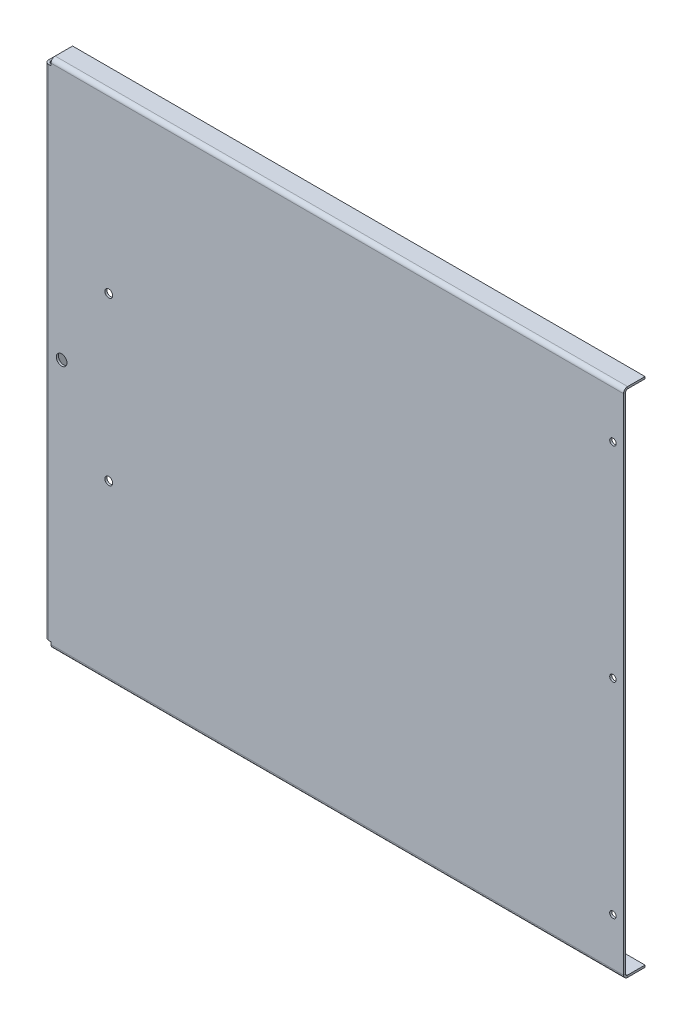
ISO-10303-21;
HEADER;
FILE_DESCRIPTION(('STEP AP214'),'2;1');
FILE_NAME('part.step','',(''),(''),'','','');
FILE_SCHEMA(('AUTOMOTIVE_DESIGN { 1 0 10303 214 1 1 1 1 }'));
ENDSEC;
DATA;
#1=APPLICATION_CONTEXT('core data for automotive mechanical design processes');
#2=APPLICATION_PROTOCOL_DEFINITION('international standard','automotive_design',2000,#1);
#3=PRODUCT_CONTEXT('',#1,'mechanical');
#4=PRODUCT('Part','Part','',(#3));
#5=PRODUCT_RELATED_PRODUCT_CATEGORY('part','',(#4));
#6=PRODUCT_DEFINITION_FORMATION('','',#4);
#7=PRODUCT_DEFINITION_CONTEXT('part definition',#1,'design');
#8=PRODUCT_DEFINITION('design','',#6,#7);
#9=PRODUCT_DEFINITION_SHAPE('','',#8);
#10=(LENGTH_UNIT() NAMED_UNIT(*) SI_UNIT(.MILLI.,.METRE.));
#11=(NAMED_UNIT(*) PLANE_ANGLE_UNIT() SI_UNIT($,.RADIAN.));
#12=(NAMED_UNIT(*) SI_UNIT($,.STERADIAN.) SOLID_ANGLE_UNIT());
#13=UNCERTAINTY_MEASURE_WITH_UNIT(LENGTH_MEASURE(1.E-05),#10,'distance_accuracy_value','');
#14=(GEOMETRIC_REPRESENTATION_CONTEXT(3) GLOBAL_UNCERTAINTY_ASSIGNED_CONTEXT((#13)) GLOBAL_UNIT_ASSIGNED_CONTEXT((#10,
#11,#12)) REPRESENTATION_CONTEXT('',''));
#15=CARTESIAN_POINT('',(0.,0.,0.));
#16=DIRECTION('',(0.,0.,1.));
#17=DIRECTION('',(1.,0.,0.));
#18=AXIS2_PLACEMENT_3D('',#15,#16,#17);
#19=CARTESIAN_POINT('',(0.,0.,-1.524));
#20=DIRECTION('',(0.,0.,-1.));
#21=DIRECTION('',(-1.,0.,0.));
#22=AXIS2_PLACEMENT_3D('',#19,#20,#21);
#23=PLANE('',#22);
#24=CARTESIAN_POINT('',(-202.819,0.,-1.524));
#25=DIRECTION('',(0.,0.,-1.));
#26=DIRECTION('',(-1.,0.,0.));
#27=AXIS2_PLACEMENT_3D('',#24,#25,#26);
#28=CIRCLE('',#27,3.9624);
#29=CARTESIAN_POINT('',(-206.7814,0.,-1.524));
#30=VERTEX_POINT('',#29);
#31=EDGE_CURVE('E571',#30,#30,#28,.F.);
#32=ORIENTED_EDGE('',*,*,#31,.T.);
#33=EDGE_LOOP('',(#32));
#34=FACE_BOUND('',#33,.T.);
#35=CARTESIAN_POINT('',(-167.767,60.452,-1.524));
#36=DIRECTION('',(0.,0.,-1.));
#37=DIRECTION('',(-1.,0.,0.));
#38=AXIS2_PLACEMENT_3D('',#35,#36,#37);
#39=CIRCLE('',#38,2.8956);
#40=CARTESIAN_POINT('',(-170.6626,60.452,-1.524));
#41=VERTEX_POINT('',#40);
#42=EDGE_CURVE('E567',#41,#41,#39,.F.);
#43=ORIENTED_EDGE('',*,*,#42,.T.);
#44=EDGE_LOOP('',(#43));
#45=FACE_BOUND('',#44,.T.);
#46=CARTESIAN_POINT('',(-167.767,-60.452,-1.524));
#47=DIRECTION('',(0.,0.,-1.));
#48=DIRECTION('',(-1.,0.,0.));
#49=AXIS2_PLACEMENT_3D('',#46,#47,#48);
#50=CIRCLE('',#49,2.8956);
#51=CARTESIAN_POINT('',(-170.6626,-60.452,-1.524));
#52=VERTEX_POINT('',#51);
#53=EDGE_CURVE('E559',#52,#52,#50,.F.);
#54=ORIENTED_EDGE('',*,*,#53,.T.);
#55=EDGE_LOOP('',(#54));
#56=FACE_BOUND('',#55,.T.);
#57=CARTESIAN_POINT('',(207.645,152.4,-1.524));
#58=DIRECTION('',(0.,0.,-1.));
#59=DIRECTION('',(-1.,0.,0.));
#60=AXIS2_PLACEMENT_3D('',#57,#58,#59);
#61=CIRCLE('',#60,2.413);
#62=CARTESIAN_POINT('',(205.232,152.4,-1.524));
#63=VERTEX_POINT('',#62);
#64=EDGE_CURVE('E551',#63,#63,#61,.F.);
#65=ORIENTED_EDGE('',*,*,#64,.T.);
#66=EDGE_LOOP('',(#65));
#67=FACE_BOUND('',#66,.T.);
#68=CARTESIAN_POINT('',(207.645,0.,-1.524));
#69=DIRECTION('',(0.,0.,-1.));
#70=DIRECTION('',(-1.,0.,0.));
#71=AXIS2_PLACEMENT_3D('',#68,#69,#70);
#72=CIRCLE('',#71,2.413);
#73=CARTESIAN_POINT('',(205.232,0.,-1.524));
#74=VERTEX_POINT('',#73);
#75=EDGE_CURVE('E543',#74,#74,#72,.F.);
#76=ORIENTED_EDGE('',*,*,#75,.T.);
#77=EDGE_LOOP('',(#76));
#78=FACE_BOUND('',#77,.T.);
#79=CARTESIAN_POINT('',(207.645,-152.4,-1.524));
#80=DIRECTION('',(0.,0.,-1.));
#81=DIRECTION('',(-1.,0.,0.));
#82=AXIS2_PLACEMENT_3D('',#79,#80,#81);
#83=CIRCLE('',#82,2.413);
#84=CARTESIAN_POINT('',(205.232,-152.4,-1.524));
#85=VERTEX_POINT('',#84);
#86=EDGE_CURVE('E535',#85,#85,#83,.F.);
#87=ORIENTED_EDGE('',*,*,#86,.T.);
#88=EDGE_LOOP('',(#87));
#89=FACE_BOUND('',#88,.T.);
#90=DIRECTION('',(-1.,0.,0.));
#91=VECTOR('',#90,1.);
#92=CARTESIAN_POINT('',(-215.519,-185.674,-1.524));
#93=LINE('',#92,#91);
#94=CARTESIAN_POINT('',(-210.693,-185.674,-1.524));
#95=VERTEX_POINT('',#94);
#96=CARTESIAN_POINT('',(-212.471,-185.674,-1.524));
#97=VERTEX_POINT('',#96);
#98=EDGE_CURVE('E502',#95,#97,#93,.T.);
#99=ORIENTED_EDGE('',*,*,#98,.T.);
#100=DIRECTION('',(0.,1.,0.));
#101=VECTOR('',#100,1.);
#102=CARTESIAN_POINT('',(-212.471,185.674,-1.524));
#103=LINE('',#102,#101);
#104=CARTESIAN_POINT('',(-212.471,185.674,-1.524));
#105=VERTEX_POINT('',#104);
#106=EDGE_CURVE('E315',#105,#97,#103,.F.);
#107=ORIENTED_EDGE('',*,*,#106,.F.);
#108=DIRECTION('',(1.,0.,0.));
#109=VECTOR('',#108,1.);
#110=CARTESIAN_POINT('',(-215.519,185.674,-1.524));
#111=LINE('',#110,#109);
#112=CARTESIAN_POINT('',(-210.693,185.674,-1.524));
#113=VERTEX_POINT('',#112);
#114=EDGE_CURVE('E490',#105,#113,#111,.T.);
#115=ORIENTED_EDGE('',*,*,#114,.T.);
#116=DIRECTION('',(0.,1.,0.));
#117=VECTOR('',#116,1.);
#118=CARTESIAN_POINT('',(-210.693,190.5,-1.524));
#119=LINE('',#118,#117);
#120=CARTESIAN_POINT('',(-210.693,187.452,-1.524));
#121=VERTEX_POINT('',#120);
#122=EDGE_CURVE('E475',#113,#121,#119,.T.);
#123=ORIENTED_EDGE('',*,*,#122,.T.);
#124=DIRECTION('',(1.,0.,0.));
#125=VECTOR('',#124,1.);
#126=CARTESIAN_POINT('',(215.519,187.452,-1.524));
#127=LINE('',#126,#125);
#128=CARTESIAN_POINT('',(215.519,187.452,-1.524));
#129=VERTEX_POINT('',#128);
#130=EDGE_CURVE('E461',#129,#121,#127,.F.);
#131=ORIENTED_EDGE('',*,*,#130,.F.);
#132=DIRECTION('',(0.,1.,0.));
#133=VECTOR('',#132,1.);
#134=CARTESIAN_POINT('',(215.519,-190.5,-1.524));
#135=LINE('',#134,#133);
#136=CARTESIAN_POINT('',(215.519,-187.452,-1.524));
#137=VERTEX_POINT('',#136);
#138=EDGE_CURVE('E13',#137,#129,#135,.T.);
#139=ORIENTED_EDGE('',*,*,#138,.F.);
#140=DIRECTION('',(-1.,0.,0.));
#141=VECTOR('',#140,1.);
#142=CARTESIAN_POINT('',(-210.693,-187.452,-1.524));
#143=LINE('',#142,#141);
#144=CARTESIAN_POINT('',(-210.693,-187.452,-1.524));
#145=VERTEX_POINT('',#144);
#146=EDGE_CURVE('E387',#145,#137,#143,.F.);
#147=ORIENTED_EDGE('',*,*,#146,.F.);
#148=DIRECTION('',(0.,1.,0.));
#149=VECTOR('',#148,1.);
#150=CARTESIAN_POINT('',(-210.693,-190.5,-1.524));
#151=LINE('',#150,#149);
#152=EDGE_CURVE('E480',#145,#95,#151,.T.);
#153=ORIENTED_EDGE('',*,*,#152,.T.);
#154=EDGE_LOOP('',(#99,#107,#115,#123,#131,#139,#147,#153));
#155=FACE_BOUND('',#154,.T.);
#156=ADVANCED_FACE('F107',(#34,#45,#56,#67,#78,#89,#155),#23,.T.);
#157=CARTESIAN_POINT('',(0.,0.,0.));
#158=DIRECTION('',(0.,0.,-1.));
#159=DIRECTION('',(-1.,0.,0.));
#160=AXIS2_PLACEMENT_3D('',#157,#158,#159);
#161=PLANE('',#160);
#162=CARTESIAN_POINT('',(-202.819,0.,0.));
#163=DIRECTION('',(0.,0.,1.));
#164=DIRECTION('',(1.,0.,0.));
#165=AXIS2_PLACEMENT_3D('',#162,#163,#164);
#166=CIRCLE('',#165,3.9624);
#167=CARTESIAN_POINT('',(-198.8566,0.,0.));
#168=VERTEX_POINT('',#167);
#169=EDGE_CURVE('E299',#168,#168,#166,.T.);
#170=ORIENTED_EDGE('',*,*,#169,.F.);
#171=EDGE_LOOP('',(#170));
#172=FACE_BOUND('',#171,.T.);
#173=CARTESIAN_POINT('',(-167.767,60.452,0.));
#174=DIRECTION('',(0.,0.,1.));
#175=DIRECTION('',(1.,0.,0.));
#176=AXIS2_PLACEMENT_3D('',#173,#174,#175);
#177=CIRCLE('',#176,2.8956);
#178=CARTESIAN_POINT('',(-164.8714,60.452,0.));
#179=VERTEX_POINT('',#178);
#180=EDGE_CURVE('E563',#179,#179,#177,.T.);
#181=ORIENTED_EDGE('',*,*,#180,.F.);
#182=EDGE_LOOP('',(#181));
#183=FACE_BOUND('',#182,.T.);
#184=CARTESIAN_POINT('',(-167.767,-60.452,0.));
#185=DIRECTION('',(0.,0.,1.));
#186=DIRECTION('',(1.,0.,0.));
#187=AXIS2_PLACEMENT_3D('',#184,#185,#186);
#188=CIRCLE('',#187,2.8956);
#189=CARTESIAN_POINT('',(-164.8714,-60.452,0.));
#190=VERTEX_POINT('',#189);
#191=EDGE_CURVE('E555',#190,#190,#188,.T.);
#192=ORIENTED_EDGE('',*,*,#191,.F.);
#193=EDGE_LOOP('',(#192));
#194=FACE_BOUND('',#193,.T.);
#195=CARTESIAN_POINT('',(207.645,152.4,0.));
#196=DIRECTION('',(0.,0.,1.));
#197=DIRECTION('',(1.,0.,0.));
#198=AXIS2_PLACEMENT_3D('',#195,#196,#197);
#199=CIRCLE('',#198,2.413);
#200=CARTESIAN_POINT('',(210.058,152.4,0.));
#201=VERTEX_POINT('',#200);
#202=EDGE_CURVE('E547',#201,#201,#199,.T.);
#203=ORIENTED_EDGE('',*,*,#202,.F.);
#204=EDGE_LOOP('',(#203));
#205=FACE_BOUND('',#204,.T.);
#206=CARTESIAN_POINT('',(207.645,0.,0.));
#207=DIRECTION('',(0.,0.,1.));
#208=DIRECTION('',(1.,0.,0.));
#209=AXIS2_PLACEMENT_3D('',#206,#207,#208);
#210=CIRCLE('',#209,2.413);
#211=CARTESIAN_POINT('',(210.058,0.,0.));
#212=VERTEX_POINT('',#211);
#213=EDGE_CURVE('E539',#212,#212,#210,.T.);
#214=ORIENTED_EDGE('',*,*,#213,.F.);
#215=EDGE_LOOP('',(#214));
#216=FACE_BOUND('',#215,.T.);
#217=CARTESIAN_POINT('',(207.645,-152.4,0.));
#218=DIRECTION('',(0.,0.,1.));
#219=DIRECTION('',(1.,0.,0.));
#220=AXIS2_PLACEMENT_3D('',#217,#218,#219);
#221=CIRCLE('',#220,2.413);
#222=CARTESIAN_POINT('',(210.058,-152.4,0.));
#223=VERTEX_POINT('',#222);
#224=EDGE_CURVE('E531',#223,#223,#221,.T.);
#225=ORIENTED_EDGE('',*,*,#224,.F.);
#226=EDGE_LOOP('',(#225));
#227=FACE_BOUND('',#226,.T.);
#228=DIRECTION('',(0.,1.,0.));
#229=VECTOR('',#228,1.);
#230=CARTESIAN_POINT('',(-212.471,185.674,0.));
#231=LINE('',#230,#229);
#232=CARTESIAN_POINT('',(-212.471,185.674,0.));
#233=VERTEX_POINT('',#232);
#234=CARTESIAN_POINT('',(-212.471,-185.674,0.));
#235=VERTEX_POINT('',#234);
#236=EDGE_CURVE('E131',#233,#235,#231,.F.);
#237=ORIENTED_EDGE('',*,*,#236,.T.);
#238=DIRECTION('',(-1.,0.,0.));
#239=VECTOR('',#238,1.);
#240=CARTESIAN_POINT('',(-215.519,-185.674,0.));
#241=LINE('',#240,#239);
#242=CARTESIAN_POINT('',(-210.693,-185.674,0.));
#243=VERTEX_POINT('',#242);
#244=EDGE_CURVE('E496',#243,#235,#241,.T.);
#245=ORIENTED_EDGE('',*,*,#244,.F.);
#246=DIRECTION('',(0.,1.,0.));
#247=VECTOR('',#246,1.);
#248=CARTESIAN_POINT('',(-210.693,-190.5,0.));
#249=LINE('',#248,#247);
#250=CARTESIAN_POINT('',(-210.693,-187.452,0.));
#251=VERTEX_POINT('',#250);
#252=EDGE_CURVE('E499',#251,#243,#249,.T.);
#253=ORIENTED_EDGE('',*,*,#252,.F.);
#254=DIRECTION('',(-1.,0.,0.));
#255=VECTOR('',#254,1.);
#256=CARTESIAN_POINT('',(-210.693,-187.452,0.));
#257=LINE('',#256,#255);
#258=CARTESIAN_POINT('',(215.519,-187.452,0.));
#259=VERTEX_POINT('',#258);
#260=EDGE_CURVE('E371',#251,#259,#257,.F.);
#261=ORIENTED_EDGE('',*,*,#260,.T.);
#262=DIRECTION('',(0.,1.,0.));
#263=VECTOR('',#262,1.);
#264=CARTESIAN_POINT('',(215.519,-190.5,0.));
#265=LINE('',#264,#263);
#266=CARTESIAN_POINT('',(215.519,187.452,0.));
#267=VERTEX_POINT('',#266);
#268=EDGE_CURVE('E111',#259,#267,#265,.T.);
#269=ORIENTED_EDGE('',*,*,#268,.T.);
#270=DIRECTION('',(1.,0.,0.));
#271=VECTOR('',#270,1.);
#272=CARTESIAN_POINT('',(215.519,187.452,0.));
#273=LINE('',#272,#271);
#274=CARTESIAN_POINT('',(-210.693,187.452,0.));
#275=VERTEX_POINT('',#274);
#276=EDGE_CURVE('E444',#267,#275,#273,.F.);
#277=ORIENTED_EDGE('',*,*,#276,.T.);
#278=DIRECTION('',(0.,1.,0.));
#279=VECTOR('',#278,1.);
#280=CARTESIAN_POINT('',(-210.693,190.5,0.));
#281=LINE('',#280,#279);
#282=CARTESIAN_POINT('',(-210.693,185.674,0.));
#283=VERTEX_POINT('',#282);
#284=EDGE_CURVE('E483',#283,#275,#281,.T.);
#285=ORIENTED_EDGE('',*,*,#284,.F.);
#286=DIRECTION('',(1.,0.,0.));
#287=VECTOR('',#286,1.);
#288=CARTESIAN_POINT('',(-215.519,185.674,0.));
#289=LINE('',#288,#287);
#290=EDGE_CURVE('E479',#233,#283,#289,.T.);
#291=ORIENTED_EDGE('',*,*,#290,.F.);
#292=EDGE_LOOP('',(#237,#245,#253,#261,#269,#277,#285,#291));
#293=FACE_BOUND('',#292,.T.);
#294=ADVANCED_FACE('F516',(#172,#183,#194,#205,#216,#227,#293),#161,.F.);
#295=CARTESIAN_POINT('',(-215.519,-185.674,-1.525));
#296=DIRECTION('',(0.,1.,0.));
#297=DIRECTION('',(0.,0.,1.));
#298=AXIS2_PLACEMENT_3D('',#295,#296,#297);
#299=PLANE('',#298);
#300=DIRECTION('',(0.,0.,1.));
#301=VECTOR('',#300,1.);
#302=CARTESIAN_POINT('',(-212.471,-185.674,-1.524));
#303=LINE('',#302,#301);
#304=EDGE_CURVE('E123',#97,#235,#303,.T.);
#305=ORIENTED_EDGE('',*,*,#304,.F.);
#306=ORIENTED_EDGE('',*,*,#98,.F.);
#307=DIRECTION('',(0.,0.,1.));
#308=VECTOR('',#307,1.);
#309=CARTESIAN_POINT('',(-210.693,-185.674,-1.525));
#310=LINE('',#309,#308);
#311=EDGE_CURVE('E472',#95,#243,#310,.T.);
#312=ORIENTED_EDGE('',*,*,#311,.T.);
#313=ORIENTED_EDGE('',*,*,#244,.T.);
#314=EDGE_LOOP('',(#305,#306,#312,#313));
#315=FACE_BOUND('',#314,.T.);
#316=ADVANCED_FACE('F513',(#315),#299,.F.);
#317=CARTESIAN_POINT('',(-215.519,185.674,-1.525));
#318=DIRECTION('',(0.,-1.,0.));
#319=DIRECTION('',(0.,0.,-1.));
#320=AXIS2_PLACEMENT_3D('',#317,#318,#319);
#321=PLANE('',#320);
#322=DIRECTION('',(0.,0.,1.));
#323=VECTOR('',#322,1.);
#324=CARTESIAN_POINT('',(-212.471,185.674,-1.524));
#325=LINE('',#324,#323);
#326=EDGE_CURVE('E307',#105,#233,#325,.T.);
#327=ORIENTED_EDGE('',*,*,#326,.T.);
#328=ORIENTED_EDGE('',*,*,#290,.T.);
#329=DIRECTION('',(0.,0.,1.));
#330=VECTOR('',#329,1.);
#331=CARTESIAN_POINT('',(-210.693,185.674,-1.525));
#332=LINE('',#331,#330);
#333=EDGE_CURVE('E486',#113,#283,#332,.T.);
#334=ORIENTED_EDGE('',*,*,#333,.F.);
#335=ORIENTED_EDGE('',*,*,#114,.F.);
#336=EDGE_LOOP('',(#327,#328,#334,#335));
#337=FACE_BOUND('',#336,.T.);
#338=ADVANCED_FACE('F618',(#337),#321,.F.);
#339=CARTESIAN_POINT('',(-210.693,-190.5,-1.525));
#340=DIRECTION('',(1.,0.,0.));
#341=DIRECTION('',(0.,1.,0.));
#342=AXIS2_PLACEMENT_3D('',#339,#340,#341);
#343=PLANE('',#342);
#344=DIRECTION('',(0.,0.,1.));
#345=VECTOR('',#344,1.);
#346=CARTESIAN_POINT('',(-210.693,-187.452,-1.524));
#347=LINE('',#346,#345);
#348=EDGE_CURVE('E379',#145,#251,#347,.T.);
#349=ORIENTED_EDGE('',*,*,#348,.T.);
#350=ORIENTED_EDGE('',*,*,#252,.T.);
#351=ORIENTED_EDGE('',*,*,#311,.F.);
#352=ORIENTED_EDGE('',*,*,#152,.F.);
#353=EDGE_LOOP('',(#349,#350,#351,#352));
#354=FACE_BOUND('',#353,.T.);
#355=ADVANCED_FACE('F514',(#354),#343,.F.);
#356=CARTESIAN_POINT('',(215.519,-190.5,-1.524));
#357=DIRECTION('',(1.,0.,0.));
#358=DIRECTION('',(0.,0.,-1.));
#359=AXIS2_PLACEMENT_3D('',#356,#357,#358);
#360=PLANE('',#359);
#361=DIRECTION('',(0.,0.,1.));
#362=VECTOR('',#361,1.);
#363=CARTESIAN_POINT('',(215.519,-187.452,-1.524));
#364=LINE('',#363,#362);
#365=EDGE_CURVE('E394',#137,#259,#364,.T.);
#366=ORIENTED_EDGE('',*,*,#365,.F.);
#367=ORIENTED_EDGE('',*,*,#138,.T.);
#368=DIRECTION('',(0.,0.,1.));
#369=VECTOR('',#368,1.);
#370=CARTESIAN_POINT('',(215.519,187.452,-1.524));
#371=LINE('',#370,#369);
#372=EDGE_CURVE('E453',#129,#267,#371,.T.);
#373=ORIENTED_EDGE('',*,*,#372,.T.);
#374=ORIENTED_EDGE('',*,*,#268,.F.);
#375=EDGE_LOOP('',(#366,#367,#373,#374));
#376=FACE_BOUND('',#375,.T.);
#377=ADVANCED_FACE('F109',(#376),#360,.T.);
#378=CARTESIAN_POINT('',(-210.693,190.5,-1.525));
#379=DIRECTION('',(1.,0.,0.));
#380=DIRECTION('',(0.,0.,-1.));
#381=AXIS2_PLACEMENT_3D('',#378,#379,#380);
#382=PLANE('',#381);
#383=DIRECTION('',(0.,0.,1.));
#384=VECTOR('',#383,1.);
#385=CARTESIAN_POINT('',(-210.693,187.452,-1.524));
#386=LINE('',#385,#384);
#387=EDGE_CURVE('E468',#121,#275,#386,.T.);
#388=ORIENTED_EDGE('',*,*,#387,.F.);
#389=ORIENTED_EDGE('',*,*,#122,.F.);
#390=ORIENTED_EDGE('',*,*,#333,.T.);
#391=ORIENTED_EDGE('',*,*,#284,.T.);
#392=EDGE_LOOP('',(#388,#389,#390,#391));
#393=FACE_BOUND('',#392,.T.);
#394=ADVANCED_FACE('F624',(#393),#382,.F.);
#395=CARTESIAN_POINT('',(-210.693,187.452,-3.048));
#396=DIRECTION('',(-1.,0.,0.));
#397=DIRECTION('',(0.,0.,1.));
#398=AXIS2_PLACEMENT_3D('',#395,#396,#397);
#399=PLANE('',#398);
#400=DIRECTION('',(0.,-1.,0.));
#401=VECTOR('',#400,1.);
#402=CARTESIAN_POINT('',(-210.693,190.5,-3.04799999999999));
#403=LINE('',#402,#401);
#404=CARTESIAN_POINT('',(-210.693,188.976,-3.048));
#405=VERTEX_POINT('',#404);
#406=CARTESIAN_POINT('',(-210.693,190.5,-3.04799999999999));
#407=VERTEX_POINT('',#406);
#408=EDGE_CURVE('E398',#405,#407,#403,.F.);
#409=ORIENTED_EDGE('',*,*,#408,.F.);
#410=CARTESIAN_POINT('',(-210.693,187.452,-3.048));
#411=DIRECTION('',(1.,0.,0.));
#412=DIRECTION('',(0.,0.,-1.));
#413=AXIS2_PLACEMENT_3D('',#410,#411,#412);
#414=CIRCLE('',#413,1.524);
#415=EDGE_CURVE('E457',#121,#405,#414,.F.);
#416=ORIENTED_EDGE('',*,*,#415,.F.);
#417=ORIENTED_EDGE('',*,*,#387,.T.);
#418=CARTESIAN_POINT('',(-210.693,187.452,-3.048));
#419=DIRECTION('',(1.,0.,0.));
#420=DIRECTION('',(0.,0.,-1.));
#421=AXIS2_PLACEMENT_3D('',#418,#419,#420);
#422=CIRCLE('',#421,3.048);
#423=EDGE_CURVE('E448',#275,#407,#422,.F.);
#424=ORIENTED_EDGE('',*,*,#423,.T.);
#425=EDGE_LOOP('',(#409,#416,#417,#424));
#426=FACE_BOUND('',#425,.T.);
#427=ADVANCED_FACE('F627',(#426),#399,.T.);
#428=CARTESIAN_POINT('',(215.519,187.452,-3.048));
#429=DIRECTION('',(-1.,0.,0.));
#430=DIRECTION('',(0.,0.,1.));
#431=AXIS2_PLACEMENT_3D('',#428,#429,#430);
#432=PLANE('',#431);
#433=CARTESIAN_POINT('',(215.519,187.452,-3.048));
#434=DIRECTION('',(1.,0.,0.));
#435=DIRECTION('',(0.,0.,-1.));
#436=AXIS2_PLACEMENT_3D('',#433,#434,#435);
#437=CIRCLE('',#436,1.524);
#438=CARTESIAN_POINT('',(215.519,188.976,-3.048));
#439=VERTEX_POINT('',#438);
#440=EDGE_CURVE('E406',#439,#129,#437,.T.);
#441=ORIENTED_EDGE('',*,*,#440,.F.);
#442=DIRECTION('',(0.,-1.,0.));
#443=VECTOR('',#442,1.);
#444=CARTESIAN_POINT('',(215.519,188.976,-3.048));
#445=LINE('',#444,#443);
#446=CARTESIAN_POINT('',(215.519,190.5,-3.04799999999999));
#447=VERTEX_POINT('',#446);
#448=EDGE_CURVE('E434',#439,#447,#445,.F.);
#449=ORIENTED_EDGE('',*,*,#448,.T.);
#450=CARTESIAN_POINT('',(215.519,187.452,-3.048));
#451=DIRECTION('',(1.,0.,0.));
#452=DIRECTION('',(0.,0.,-1.));
#453=AXIS2_PLACEMENT_3D('',#450,#451,#452);
#454=CIRCLE('',#453,3.048);
#455=EDGE_CURVE('E449',#447,#267,#454,.T.);
#456=ORIENTED_EDGE('',*,*,#455,.T.);
#457=ORIENTED_EDGE('',*,*,#372,.F.);
#458=EDGE_LOOP('',(#441,#449,#456,#457));
#459=FACE_BOUND('',#458,.T.);
#460=ADVANCED_FACE('F629',(#459),#432,.F.);
#461=CARTESIAN_POINT('',(215.519,187.452,-3.048));
#462=DIRECTION('',(1.,0.,0.));
#463=DIRECTION('',(0.,1.,0.));
#464=AXIS2_PLACEMENT_3D('',#461,#462,#463);
#465=CYLINDRICAL_SURFACE('',#464,3.048);
#466=ORIENTED_EDGE('',*,*,#276,.F.);
#467=ORIENTED_EDGE('',*,*,#455,.F.);
#468=DIRECTION('',(1.,0.,0.));
#469=VECTOR('',#468,1.);
#470=CARTESIAN_POINT('',(-210.693,190.5,-3.04799999999999));
#471=LINE('',#470,#469);
#472=EDGE_CURVE('E431',#447,#407,#471,.F.);
#473=ORIENTED_EDGE('',*,*,#472,.T.);
#474=ORIENTED_EDGE('',*,*,#423,.F.);
#475=EDGE_LOOP('',(#466,#467,#473,#474));
#476=FACE_BOUND('',#475,.T.);
#477=ADVANCED_FACE('F632',(#476),#465,.T.);
#478=CARTESIAN_POINT('',(215.519,187.452,-3.048));
#479=DIRECTION('',(1.,0.,0.));
#480=DIRECTION('',(0.,1.,0.));
#481=AXIS2_PLACEMENT_3D('',#478,#479,#480);
#482=CYLINDRICAL_SURFACE('',#481,1.524);
#483=ORIENTED_EDGE('',*,*,#130,.T.);
#484=ORIENTED_EDGE('',*,*,#415,.T.);
#485=DIRECTION('',(1.,0.,0.));
#486=VECTOR('',#485,1.);
#487=CARTESIAN_POINT('',(-210.693,188.976,-3.048));
#488=LINE('',#487,#486);
#489=EDGE_CURVE('E438',#405,#439,#488,.T.);
#490=ORIENTED_EDGE('',*,*,#489,.T.);
#491=ORIENTED_EDGE('',*,*,#440,.T.);
#492=EDGE_LOOP('',(#483,#484,#490,#491));
#493=FACE_BOUND('',#492,.T.);
#494=ADVANCED_FACE('F637',(#493),#482,.F.);
#495=CARTESIAN_POINT('',(215.519,190.5,-16.002));
#496=DIRECTION('',(-1.,0.,0.));
#497=DIRECTION('',(0.,0.,1.));
#498=AXIS2_PLACEMENT_3D('',#495,#496,#497);
#499=PLANE('',#498);
#500=ORIENTED_EDGE('',*,*,#448,.F.);
#501=DIRECTION('',(0.,0.,1.));
#502=VECTOR('',#501,1.);
#503=CARTESIAN_POINT('',(215.519,188.976,-16.002));
#504=LINE('',#503,#502);
#505=CARTESIAN_POINT('',(215.519,188.976,-16.002));
#506=VERTEX_POINT('',#505);
#507=EDGE_CURVE('E428',#439,#506,#504,.F.);
#508=ORIENTED_EDGE('',*,*,#507,.T.);
#509=DIRECTION('',(0.,-1.,0.));
#510=VECTOR('',#509,1.);
#511=CARTESIAN_POINT('',(215.519,190.5,-16.002));
#512=LINE('',#511,#510);
#513=CARTESIAN_POINT('',(215.519,190.5,-16.002));
#514=VERTEX_POINT('',#513);
#515=EDGE_CURVE('E402',#514,#506,#512,.T.);
#516=ORIENTED_EDGE('',*,*,#515,.F.);
#517=DIRECTION('',(0.,0.,-1.));
#518=VECTOR('',#517,1.);
#519=CARTESIAN_POINT('',(215.519,190.5,7.3573090218221E-13));
#520=LINE('',#519,#518);
#521=EDGE_CURVE('E418',#447,#514,#520,.T.);
#522=ORIENTED_EDGE('',*,*,#521,.F.);
#523=EDGE_LOOP('',(#500,#508,#516,#522));
#524=FACE_BOUND('',#523,.T.);
#525=ADVANCED_FACE('F640',(#524),#499,.F.);
#526=CARTESIAN_POINT('',(-210.693,190.5,-1.52399999999999));
#527=DIRECTION('',(1.,0.,0.));
#528=DIRECTION('',(0.,0.,-1.));
#529=AXIS2_PLACEMENT_3D('',#526,#527,#528);
#530=PLANE('',#529);
#531=ORIENTED_EDGE('',*,*,#408,.T.);
#532=DIRECTION('',(0.,0.,1.));
#533=VECTOR('',#532,1.);
#534=CARTESIAN_POINT('',(-210.693,190.5,7.3573090218221E-13));
#535=LINE('',#534,#533);
#536=CARTESIAN_POINT('',(-210.693,190.5,-16.002));
#537=VERTEX_POINT('',#536);
#538=EDGE_CURVE('E411',#537,#407,#535,.T.);
#539=ORIENTED_EDGE('',*,*,#538,.F.);
#540=DIRECTION('',(0.,-1.,0.));
#541=VECTOR('',#540,1.);
#542=CARTESIAN_POINT('',(-210.693,190.5,-16.002));
#543=LINE('',#542,#541);
#544=CARTESIAN_POINT('',(-210.693,188.976,-16.002));
#545=VERTEX_POINT('',#544);
#546=EDGE_CURVE('E407',#537,#545,#543,.T.);
#547=ORIENTED_EDGE('',*,*,#546,.T.);
#548=DIRECTION('',(0.,0.,-1.));
#549=VECTOR('',#548,1.);
#550=CARTESIAN_POINT('',(-210.693,188.976,-1.524));
#551=LINE('',#550,#549);
#552=EDGE_CURVE('E421',#545,#405,#551,.F.);
#553=ORIENTED_EDGE('',*,*,#552,.T.);
#554=EDGE_LOOP('',(#531,#539,#547,#553));
#555=FACE_BOUND('',#554,.T.);
#556=ADVANCED_FACE('F647',(#555),#530,.F.);
#557=CARTESIAN_POINT('',(0.,190.5,7.3573090218221E-13));
#558=DIRECTION('',(0.,-1.,0.));
#559=DIRECTION('',(0.,0.,-1.));
#560=AXIS2_PLACEMENT_3D('',#557,#558,#559);
#561=PLANE('',#560);
#562=ORIENTED_EDGE('',*,*,#472,.F.);
#563=ORIENTED_EDGE('',*,*,#521,.T.);
#564=DIRECTION('',(-1.,0.,0.));
#565=VECTOR('',#564,1.);
#566=CARTESIAN_POINT('',(0.,190.5,-16.002));
#567=LINE('',#566,#565);
#568=EDGE_CURVE('E415',#514,#537,#567,.T.);
#569=ORIENTED_EDGE('',*,*,#568,.T.);
#570=ORIENTED_EDGE('',*,*,#538,.T.);
#571=EDGE_LOOP('',(#562,#563,#569,#570));
#572=FACE_BOUND('',#571,.T.);
#573=ADVANCED_FACE('F657',(#572),#561,.F.);
#574=CARTESIAN_POINT('',(0.,188.976,7.30409884621813E-13));
#575=DIRECTION('',(0.,-1.,0.));
#576=DIRECTION('',(0.,0.,-1.));
#577=AXIS2_PLACEMENT_3D('',#574,#575,#576);
#578=PLANE('',#577);
#579=ORIENTED_EDGE('',*,*,#507,.F.);
#580=ORIENTED_EDGE('',*,*,#489,.F.);
#581=ORIENTED_EDGE('',*,*,#552,.F.);
#582=DIRECTION('',(1.,0.,0.));
#583=VECTOR('',#582,1.);
#584=CARTESIAN_POINT('',(-210.693,188.976,-16.002));
#585=LINE('',#584,#583);
#586=EDGE_CURVE('E425',#506,#545,#585,.F.);
#587=ORIENTED_EDGE('',*,*,#586,.F.);
#588=EDGE_LOOP('',(#579,#580,#581,#587));
#589=FACE_BOUND('',#588,.T.);
#590=ADVANCED_FACE('F653',(#589),#578,.T.);
#591=CARTESIAN_POINT('',(-210.693,190.5,-16.002));
#592=DIRECTION('',(0.,0.,1.));
#593=DIRECTION('',(0.,-1.,0.));
#594=AXIS2_PLACEMENT_3D('',#591,#592,#593);
#595=PLANE('',#594);
#596=ORIENTED_EDGE('',*,*,#586,.T.);
#597=ORIENTED_EDGE('',*,*,#546,.F.);
#598=ORIENTED_EDGE('',*,*,#568,.F.);
#599=ORIENTED_EDGE('',*,*,#515,.T.);
#600=EDGE_LOOP('',(#596,#597,#598,#599));
#601=FACE_BOUND('',#600,.T.);
#602=ADVANCED_FACE('F649',(#601),#595,.F.);
#603=CARTESIAN_POINT('',(215.519,-187.452,-3.048));
#604=DIRECTION('',(1.,0.,0.));
#605=DIRECTION('',(0.,0.,-1.));
#606=AXIS2_PLACEMENT_3D('',#603,#604,#605);
#607=PLANE('',#606);
#608=DIRECTION('',(0.,1.,0.));
#609=VECTOR('',#608,1.);
#610=CARTESIAN_POINT('',(215.519,-190.5,-3.04799999999999));
#611=LINE('',#610,#609);
#612=CARTESIAN_POINT('',(215.519,-188.976,-3.048));
#613=VERTEX_POINT('',#612);
#614=CARTESIAN_POINT('',(215.519,-190.5,-3.04799999999999));
#615=VERTEX_POINT('',#614);
#616=EDGE_CURVE('E325',#613,#615,#611,.F.);
#617=ORIENTED_EDGE('',*,*,#616,.F.);
#618=CARTESIAN_POINT('',(215.519,-187.452,-3.048));
#619=DIRECTION('',(-1.,0.,0.));
#620=DIRECTION('',(0.,0.,1.));
#621=AXIS2_PLACEMENT_3D('',#618,#619,#620);
#622=CIRCLE('',#621,1.524);
#623=EDGE_CURVE('E383',#137,#613,#622,.F.);
#624=ORIENTED_EDGE('',*,*,#623,.F.);
#625=ORIENTED_EDGE('',*,*,#365,.T.);
#626=CARTESIAN_POINT('',(215.519,-187.452,-3.048));
#627=DIRECTION('',(-1.,0.,0.));
#628=DIRECTION('',(0.,0.,1.));
#629=AXIS2_PLACEMENT_3D('',#626,#627,#628);
#630=CIRCLE('',#629,3.048);
#631=EDGE_CURVE('E374',#259,#615,#630,.F.);
#632=ORIENTED_EDGE('',*,*,#631,.T.);
#633=EDGE_LOOP('',(#617,#624,#625,#632));
#634=FACE_BOUND('',#633,.T.);
#635=ADVANCED_FACE('F652',(#634),#607,.T.);
#636=CARTESIAN_POINT('',(-210.693,-187.452,-3.048));
#637=DIRECTION('',(1.,0.,0.));
#638=DIRECTION('',(0.,0.,-1.));
#639=AXIS2_PLACEMENT_3D('',#636,#637,#638);
#640=PLANE('',#639);
#641=CARTESIAN_POINT('',(-210.693,-187.452,-3.048));
#642=DIRECTION('',(-1.,0.,0.));
#643=DIRECTION('',(0.,0.,1.));
#644=AXIS2_PLACEMENT_3D('',#641,#642,#643);
#645=CIRCLE('',#644,1.524);
#646=CARTESIAN_POINT('',(-210.693,-188.976,-3.048));
#647=VERTEX_POINT('',#646);
#648=EDGE_CURVE('E333',#647,#145,#645,.T.);
#649=ORIENTED_EDGE('',*,*,#648,.F.);
#650=DIRECTION('',(0.,1.,0.));
#651=VECTOR('',#650,1.);
#652=CARTESIAN_POINT('',(-210.693,-188.976,-3.048));
#653=LINE('',#652,#651);
#654=CARTESIAN_POINT('',(-210.693,-190.5,-3.04799999999999));
#655=VERTEX_POINT('',#654);
#656=EDGE_CURVE('E361',#647,#655,#653,.F.);
#657=ORIENTED_EDGE('',*,*,#656,.T.);
#658=CARTESIAN_POINT('',(-210.693,-187.452,-3.048));
#659=DIRECTION('',(-1.,0.,0.));
#660=DIRECTION('',(0.,0.,1.));
#661=AXIS2_PLACEMENT_3D('',#658,#659,#660);
#662=CIRCLE('',#661,3.048);
#663=EDGE_CURVE('E375',#655,#251,#662,.T.);
#664=ORIENTED_EDGE('',*,*,#663,.T.);
#665=ORIENTED_EDGE('',*,*,#348,.F.);
#666=EDGE_LOOP('',(#649,#657,#664,#665));
#667=FACE_BOUND('',#666,.T.);
#668=ADVANCED_FACE('F665',(#667),#640,.F.);
#669=CARTESIAN_POINT('',(-210.693,-187.452,-3.048));
#670=DIRECTION('',(-1.,0.,0.));
#671=DIRECTION('',(0.,-1.,0.));
#672=AXIS2_PLACEMENT_3D('',#669,#670,#671);
#673=CYLINDRICAL_SURFACE('',#672,3.048);
#674=ORIENTED_EDGE('',*,*,#260,.F.);
#675=ORIENTED_EDGE('',*,*,#663,.F.);
#676=DIRECTION('',(-1.,0.,0.));
#677=VECTOR('',#676,1.);
#678=CARTESIAN_POINT('',(215.519,-190.5,-3.04799999999999));
#679=LINE('',#678,#677);
#680=EDGE_CURVE('E358',#655,#615,#679,.F.);
#681=ORIENTED_EDGE('',*,*,#680,.T.);
#682=ORIENTED_EDGE('',*,*,#631,.F.);
#683=EDGE_LOOP('',(#674,#675,#681,#682));
#684=FACE_BOUND('',#683,.T.);
#685=ADVANCED_FACE('F668',(#684),#673,.T.);
#686=CARTESIAN_POINT('',(-210.693,-187.452,-3.048));
#687=DIRECTION('',(-1.,0.,0.));
#688=DIRECTION('',(0.,-1.,0.));
#689=AXIS2_PLACEMENT_3D('',#686,#687,#688);
#690=CYLINDRICAL_SURFACE('',#689,1.524);
#691=ORIENTED_EDGE('',*,*,#146,.T.);
#692=ORIENTED_EDGE('',*,*,#623,.T.);
#693=DIRECTION('',(-1.,0.,0.));
#694=VECTOR('',#693,1.);
#695=CARTESIAN_POINT('',(215.519,-188.976,-3.048));
#696=LINE('',#695,#694);
#697=EDGE_CURVE('E365',#613,#647,#696,.T.);
#698=ORIENTED_EDGE('',*,*,#697,.T.);
#699=ORIENTED_EDGE('',*,*,#648,.T.);
#700=EDGE_LOOP('',(#691,#692,#698,#699));
#701=FACE_BOUND('',#700,.T.);
#702=ADVANCED_FACE('F673',(#701),#690,.F.);
#703=CARTESIAN_POINT('',(-210.693,-190.5,-16.002));
#704=DIRECTION('',(1.,0.,0.));
#705=DIRECTION('',(0.,0.,-1.));
#706=AXIS2_PLACEMENT_3D('',#703,#704,#705);
#707=PLANE('',#706);
#708=ORIENTED_EDGE('',*,*,#656,.F.);
#709=DIRECTION('',(0.,0.,1.));
#710=VECTOR('',#709,1.);
#711=CARTESIAN_POINT('',(-210.693,-188.976,-16.002));
#712=LINE('',#711,#710);
#713=CARTESIAN_POINT('',(-210.693,-188.976,-16.002));
#714=VERTEX_POINT('',#713);
#715=EDGE_CURVE('E355',#647,#714,#712,.F.);
#716=ORIENTED_EDGE('',*,*,#715,.T.);
#717=DIRECTION('',(0.,1.,0.));
#718=VECTOR('',#717,1.);
#719=CARTESIAN_POINT('',(-210.693,-190.5,-16.002));
#720=LINE('',#719,#718);
#721=CARTESIAN_POINT('',(-210.693,-190.5,-16.002));
#722=VERTEX_POINT('',#721);
#723=EDGE_CURVE('E329',#722,#714,#720,.T.);
#724=ORIENTED_EDGE('',*,*,#723,.F.);
#725=DIRECTION('',(0.,0.,-1.));
#726=VECTOR('',#725,1.);
#727=CARTESIAN_POINT('',(-210.693,-190.5,7.3573090218221E-13));
#728=LINE('',#727,#726);
#729=EDGE_CURVE('E345',#655,#722,#728,.T.);
#730=ORIENTED_EDGE('',*,*,#729,.F.);
#731=EDGE_LOOP('',(#708,#716,#724,#730));
#732=FACE_BOUND('',#731,.T.);
#733=ADVANCED_FACE('F676',(#732),#707,.F.);
#734=CARTESIAN_POINT('',(215.519,-190.5,-1.52399999999999));
#735=DIRECTION('',(-1.,0.,0.));
#736=DIRECTION('',(0.,0.,1.));
#737=AXIS2_PLACEMENT_3D('',#734,#735,#736);
#738=PLANE('',#737);
#739=ORIENTED_EDGE('',*,*,#616,.T.);
#740=DIRECTION('',(0.,0.,1.));
#741=VECTOR('',#740,1.);
#742=CARTESIAN_POINT('',(215.519,-190.5,7.3573090218221E-13));
#743=LINE('',#742,#741);
#744=CARTESIAN_POINT('',(215.519,-190.5,-16.002));
#745=VERTEX_POINT('',#744);
#746=EDGE_CURVE('E338',#745,#615,#743,.T.);
#747=ORIENTED_EDGE('',*,*,#746,.F.);
#748=DIRECTION('',(0.,1.,0.));
#749=VECTOR('',#748,1.);
#750=CARTESIAN_POINT('',(215.519,-190.5,-16.002));
#751=LINE('',#750,#749);
#752=CARTESIAN_POINT('',(215.519,-188.976,-16.002));
#753=VERTEX_POINT('',#752);
#754=EDGE_CURVE('E334',#745,#753,#751,.T.);
#755=ORIENTED_EDGE('',*,*,#754,.T.);
#756=DIRECTION('',(0.,0.,-1.));
#757=VECTOR('',#756,1.);
#758=CARTESIAN_POINT('',(215.519,-188.976,-1.524));
#759=LINE('',#758,#757);
#760=EDGE_CURVE('E348',#753,#613,#759,.F.);
#761=ORIENTED_EDGE('',*,*,#760,.T.);
#762=EDGE_LOOP('',(#739,#747,#755,#761));
#763=FACE_BOUND('',#762,.T.);
#764=ADVANCED_FACE('F683',(#763),#738,.F.);
#765=CARTESIAN_POINT('',(0.,-190.5,7.3573090218221E-13));
#766=DIRECTION('',(0.,1.,0.));
#767=DIRECTION('',(0.,0.,1.));
#768=AXIS2_PLACEMENT_3D('',#765,#766,#767);
#769=PLANE('',#768);
#770=ORIENTED_EDGE('',*,*,#680,.F.);
#771=ORIENTED_EDGE('',*,*,#729,.T.);
#772=DIRECTION('',(1.,0.,0.));
#773=VECTOR('',#772,1.);
#774=CARTESIAN_POINT('',(0.,-190.5,-16.002));
#775=LINE('',#774,#773);
#776=EDGE_CURVE('E342',#722,#745,#775,.T.);
#777=ORIENTED_EDGE('',*,*,#776,.T.);
#778=ORIENTED_EDGE('',*,*,#746,.T.);
#779=EDGE_LOOP('',(#770,#771,#777,#778));
#780=FACE_BOUND('',#779,.T.);
#781=ADVANCED_FACE('F692',(#780),#769,.F.);
#782=CARTESIAN_POINT('',(0.,-188.976,7.30409884621813E-13));
#783=DIRECTION('',(0.,1.,0.));
#784=DIRECTION('',(0.,0.,1.));
#785=AXIS2_PLACEMENT_3D('',#782,#783,#784);
#786=PLANE('',#785);
#787=ORIENTED_EDGE('',*,*,#715,.F.);
#788=ORIENTED_EDGE('',*,*,#697,.F.);
#789=ORIENTED_EDGE('',*,*,#760,.F.);
#790=DIRECTION('',(-1.,0.,0.));
#791=VECTOR('',#790,1.);
#792=CARTESIAN_POINT('',(215.519,-188.976,-16.002));
#793=LINE('',#792,#791);
#794=EDGE_CURVE('E352',#714,#753,#793,.F.);
#795=ORIENTED_EDGE('',*,*,#794,.F.);
#796=EDGE_LOOP('',(#787,#788,#789,#795));
#797=FACE_BOUND('',#796,.T.);
#798=ADVANCED_FACE('F688',(#797),#786,.T.);
#799=CARTESIAN_POINT('',(215.519,-190.5,-16.002));
#800=DIRECTION('',(0.,0.,1.));
#801=DIRECTION('',(0.,-1.,0.));
#802=AXIS2_PLACEMENT_3D('',#799,#800,#801);
#803=PLANE('',#802);
#804=ORIENTED_EDGE('',*,*,#794,.T.);
#805=ORIENTED_EDGE('',*,*,#754,.F.);
#806=ORIENTED_EDGE('',*,*,#776,.F.);
#807=ORIENTED_EDGE('',*,*,#723,.T.);
#808=EDGE_LOOP('',(#804,#805,#806,#807));
#809=FACE_BOUND('',#808,.T.);
#810=ADVANCED_FACE('F685',(#809),#803,.F.);
#811=CARTESIAN_POINT('',(-212.471,-185.674,-3.048));
#812=DIRECTION('',(0.,-1.,0.));
#813=DIRECTION('',(0.,0.,-1.));
#814=AXIS2_PLACEMENT_3D('',#811,#812,#813);
#815=PLANE('',#814);
#816=DIRECTION('',(1.,0.,0.));
#817=VECTOR('',#816,1.);
#818=CARTESIAN_POINT('',(-215.519,-185.674,-3.04799999999999));
#819=LINE('',#818,#817);
#820=CARTESIAN_POINT('',(-213.995,-185.674,-3.048));
#821=VERTEX_POINT('',#820);
#822=CARTESIAN_POINT('',(-215.519,-185.674,-3.04799999999999));
#823=VERTEX_POINT('',#822);
#824=EDGE_CURVE('E272',#821,#823,#819,.F.);
#825=ORIENTED_EDGE('',*,*,#824,.F.);
#826=CARTESIAN_POINT('',(-212.471,-185.674,-3.048));
#827=DIRECTION('',(0.,1.,0.));
#828=DIRECTION('',(0.,0.,1.));
#829=AXIS2_PLACEMENT_3D('',#826,#827,#828);
#830=CIRCLE('',#829,1.524);
#831=EDGE_CURVE('E311',#97,#821,#830,.F.);
#832=ORIENTED_EDGE('',*,*,#831,.F.);
#833=ORIENTED_EDGE('',*,*,#304,.T.);
#834=CARTESIAN_POINT('',(-212.471,-185.674,-3.048));
#835=DIRECTION('',(0.,1.,0.));
#836=DIRECTION('',(0.,0.,1.));
#837=AXIS2_PLACEMENT_3D('',#834,#835,#836);
#838=CIRCLE('',#837,3.048);
#839=EDGE_CURVE('E302',#235,#823,#838,.F.);
#840=ORIENTED_EDGE('',*,*,#839,.T.);
#841=EDGE_LOOP('',(#825,#832,#833,#840));
#842=FACE_BOUND('',#841,.T.);
#843=ADVANCED_FACE('F522',(#842),#815,.T.);
#844=CARTESIAN_POINT('',(-212.471,185.674,-3.048));
#845=DIRECTION('',(0.,-1.,0.));
#846=DIRECTION('',(0.,0.,-1.));
#847=AXIS2_PLACEMENT_3D('',#844,#845,#846);
#848=PLANE('',#847);
#849=CARTESIAN_POINT('',(-212.471,185.674,-3.048));
#850=DIRECTION('',(0.,1.,0.));
#851=DIRECTION('',(0.,0.,1.));
#852=AXIS2_PLACEMENT_3D('',#849,#850,#851);
#853=CIRCLE('',#852,1.524);
#854=CARTESIAN_POINT('',(-213.995,185.674,-3.048));
#855=VERTEX_POINT('',#854);
#856=EDGE_CURVE('E319',#855,#105,#853,.T.);
#857=ORIENTED_EDGE('',*,*,#856,.F.);
#858=DIRECTION('',(1.,0.,0.));
#859=VECTOR('',#858,1.);
#860=CARTESIAN_POINT('',(-213.995,185.674,-3.048));
#861=LINE('',#860,#859);
#862=CARTESIAN_POINT('',(-215.519,185.674,-3.04799999999999));
#863=VERTEX_POINT('',#862);
#864=EDGE_CURVE('E290',#855,#863,#861,.F.);
#865=ORIENTED_EDGE('',*,*,#864,.T.);
#866=CARTESIAN_POINT('',(-212.471,185.674,-3.048));
#867=DIRECTION('',(0.,1.,0.));
#868=DIRECTION('',(0.,0.,1.));
#869=AXIS2_PLACEMENT_3D('',#866,#867,#868);
#870=CIRCLE('',#869,3.048);
#871=EDGE_CURVE('E303',#863,#233,#870,.T.);
#872=ORIENTED_EDGE('',*,*,#871,.T.);
#873=ORIENTED_EDGE('',*,*,#326,.F.);
#874=EDGE_LOOP('',(#857,#865,#872,#873));
#875=FACE_BOUND('',#874,.T.);
#876=ADVANCED_FACE('F700',(#875),#848,.F.);
#877=CARTESIAN_POINT('',(-212.471,185.674,-3.048));
#878=DIRECTION('',(0.,1.,0.));
#879=DIRECTION('',(-1.,0.,0.));
#880=AXIS2_PLACEMENT_3D('',#877,#878,#879);
#881=CYLINDRICAL_SURFACE('',#880,3.048);
#882=ORIENTED_EDGE('',*,*,#236,.F.);
#883=ORIENTED_EDGE('',*,*,#871,.F.);
#884=DIRECTION('',(0.,1.,0.));
#885=VECTOR('',#884,1.);
#886=CARTESIAN_POINT('',(-215.519,-185.674,-3.04799999999999));
#887=LINE('',#886,#885);
#888=EDGE_CURVE('E287',#863,#823,#887,.F.);
#889=ORIENTED_EDGE('',*,*,#888,.T.);
#890=ORIENTED_EDGE('',*,*,#839,.F.);
#891=EDGE_LOOP('',(#882,#883,#889,#890));
#892=FACE_BOUND('',#891,.T.);
#893=ADVANCED_FACE('F524',(#892),#881,.T.);
#894=CARTESIAN_POINT('',(-212.471,185.674,-3.048));
#895=DIRECTION('',(0.,1.,0.));
#896=DIRECTION('',(-1.,0.,0.));
#897=AXIS2_PLACEMENT_3D('',#894,#895,#896);
#898=CYLINDRICAL_SURFACE('',#897,1.524);
#899=ORIENTED_EDGE('',*,*,#106,.T.);
#900=ORIENTED_EDGE('',*,*,#831,.T.);
#901=DIRECTION('',(0.,1.,0.));
#902=VECTOR('',#901,1.);
#903=CARTESIAN_POINT('',(-213.995,-185.674,-3.048));
#904=LINE('',#903,#902);
#905=EDGE_CURVE('E294',#821,#855,#904,.T.);
#906=ORIENTED_EDGE('',*,*,#905,.T.);
#907=ORIENTED_EDGE('',*,*,#856,.T.);
#908=EDGE_LOOP('',(#899,#900,#906,#907));
#909=FACE_BOUND('',#908,.T.);
#910=ADVANCED_FACE('F706',(#909),#898,.F.);
#911=CARTESIAN_POINT('',(-215.519,185.674,-16.002));
#912=DIRECTION('',(0.,-1.,0.));
#913=DIRECTION('',(0.,0.,-1.));
#914=AXIS2_PLACEMENT_3D('',#911,#912,#913);
#915=PLANE('',#914);
#916=ORIENTED_EDGE('',*,*,#864,.F.);
#917=DIRECTION('',(0.,0.,1.));
#918=VECTOR('',#917,1.);
#919=CARTESIAN_POINT('',(-213.995,185.674,-16.002));
#920=LINE('',#919,#918);
#921=CARTESIAN_POINT('',(-213.995,185.674,-16.002));
#922=VERTEX_POINT('',#921);
#923=EDGE_CURVE('E284',#855,#922,#920,.F.);
#924=ORIENTED_EDGE('',*,*,#923,.T.);
#925=DIRECTION('',(1.,0.,0.));
#926=VECTOR('',#925,1.);
#927=CARTESIAN_POINT('',(-215.519,185.674,-16.002));
#928=LINE('',#927,#926);
#929=CARTESIAN_POINT('',(-215.519,185.674,-16.002));
#930=VERTEX_POINT('',#929);
#931=EDGE_CURVE('E268',#930,#922,#928,.T.);
#932=ORIENTED_EDGE('',*,*,#931,.F.);
#933=DIRECTION('',(0.,0.,-1.));
#934=VECTOR('',#933,1.);
#935=CARTESIAN_POINT('',(-215.519,185.674,8.31658067029209E-13));
#936=LINE('',#935,#934);
#937=EDGE_CURVE('E253',#863,#930,#936,.T.);
#938=ORIENTED_EDGE('',*,*,#937,.F.);
#939=EDGE_LOOP('',(#916,#924,#932,#938));
#940=FACE_BOUND('',#939,.T.);
#941=ADVANCED_FACE('F527',(#940),#915,.F.);
#942=CARTESIAN_POINT('',(-215.519,-185.674,-1.52399999999999));
#943=DIRECTION('',(0.,1.,0.));
#944=DIRECTION('',(0.,0.,1.));
#945=AXIS2_PLACEMENT_3D('',#942,#943,#944);
#946=PLANE('',#945);
#947=ORIENTED_EDGE('',*,*,#824,.T.);
#948=DIRECTION('',(0.,0.,1.));
#949=VECTOR('',#948,1.);
#950=CARTESIAN_POINT('',(-215.519,-185.674,8.31658067029209E-13));
#951=LINE('',#950,#949);
#952=CARTESIAN_POINT('',(-215.519,-185.674,-16.002));
#953=VERTEX_POINT('',#952);
#954=EDGE_CURVE('E251',#953,#823,#951,.T.);
#955=ORIENTED_EDGE('',*,*,#954,.F.);
#956=DIRECTION('',(1.,0.,0.));
#957=VECTOR('',#956,1.);
#958=CARTESIAN_POINT('',(-215.519,-185.674,-16.002));
#959=LINE('',#958,#957);
#960=CARTESIAN_POINT('',(-213.995,-185.674,-16.002));
#961=VERTEX_POINT('',#960);
#962=EDGE_CURVE('E260',#953,#961,#959,.T.);
#963=ORIENTED_EDGE('',*,*,#962,.T.);
#964=DIRECTION('',(0.,0.,-1.));
#965=VECTOR('',#964,1.);
#966=CARTESIAN_POINT('',(-213.995,-185.674,-1.524));
#967=LINE('',#966,#965);
#968=EDGE_CURVE('E279',#961,#821,#967,.F.);
#969=ORIENTED_EDGE('',*,*,#968,.T.);
#970=EDGE_LOOP('',(#947,#955,#963,#969));
#971=FACE_BOUND('',#970,.T.);
#972=ADVANCED_FACE('F271',(#971),#946,.F.);
#973=CARTESIAN_POINT('',(-215.519,0.,8.31658067029209E-13));
#974=DIRECTION('',(1.,0.,0.));
#975=DIRECTION('',(0.,0.,-1.));
#976=AXIS2_PLACEMENT_3D('',#973,#974,#975);
#977=PLANE('',#976);
#978=ORIENTED_EDGE('',*,*,#888,.F.);
#979=ORIENTED_EDGE('',*,*,#937,.T.);
#980=DIRECTION('',(0.,-1.,0.));
#981=VECTOR('',#980,1.);
#982=CARTESIAN_POINT('',(-215.519,0.,-16.002));
#983=LINE('',#982,#981);
#984=EDGE_CURVE('E246',#930,#953,#983,.T.);
#985=ORIENTED_EDGE('',*,*,#984,.T.);
#986=ORIENTED_EDGE('',*,*,#954,.T.);
#987=EDGE_LOOP('',(#978,#979,#985,#986));
#988=FACE_BOUND('',#987,.T.);
#989=ADVANCED_FACE('F249',(#988),#977,.F.);
#990=CARTESIAN_POINT('',(-213.995,0.,8.26337049468812E-13));
#991=DIRECTION('',(1.,0.,0.));
#992=DIRECTION('',(0.,0.,-1.));
#993=AXIS2_PLACEMENT_3D('',#990,#991,#992);
#994=PLANE('',#993);
#995=ORIENTED_EDGE('',*,*,#923,.F.);
#996=ORIENTED_EDGE('',*,*,#905,.F.);
#997=ORIENTED_EDGE('',*,*,#968,.F.);
#998=DIRECTION('',(0.,1.,0.));
#999=VECTOR('',#998,1.);
#1000=CARTESIAN_POINT('',(-213.995,-185.674,-16.002));
#1001=LINE('',#1000,#999);
#1002=EDGE_CURVE('E263',#922,#961,#1001,.F.);
#1003=ORIENTED_EDGE('',*,*,#1002,.F.);
#1004=EDGE_LOOP('',(#995,#996,#997,#1003));
#1005=FACE_BOUND('',#1004,.T.);
#1006=ADVANCED_FACE('F605',(#1005),#994,.T.);
#1007=CARTESIAN_POINT('',(-215.519,-185.674,-16.002));
#1008=DIRECTION('',(0.,0.,1.));
#1009=DIRECTION('',(1.,0.,0.));
#1010=AXIS2_PLACEMENT_3D('',#1007,#1008,#1009);
#1011=PLANE('',#1010);
#1012=ORIENTED_EDGE('',*,*,#1002,.T.);
#1013=ORIENTED_EDGE('',*,*,#962,.F.);
#1014=ORIENTED_EDGE('',*,*,#984,.F.);
#1015=ORIENTED_EDGE('',*,*,#931,.T.);
#1016=EDGE_LOOP('',(#1012,#1013,#1014,#1015));
#1017=FACE_BOUND('',#1016,.T.);
#1018=ADVANCED_FACE('F261',(#1017),#1011,.F.);
#1019=CARTESIAN_POINT('',(207.645,-152.4,-16.003));
#1020=DIRECTION('',(0.,0.,1.));
#1021=DIRECTION('',(1.,0.,0.));
#1022=AXIS2_PLACEMENT_3D('',#1019,#1020,#1021);
#1023=CYLINDRICAL_SURFACE('',#1022,2.413);
#1024=ORIENTED_EDGE('',*,*,#86,.F.);
#1025=EDGE_LOOP('',(#1024));
#1026=FACE_BOUND('',#1025,.T.);
#1027=ORIENTED_EDGE('',*,*,#224,.T.);
#1028=EDGE_LOOP('',(#1027));
#1029=FACE_BOUND('',#1028,.T.);
#1030=ADVANCED_FACE('F593',(#1026,#1029),#1023,.F.);
#1031=CARTESIAN_POINT('',(207.645,0.,-16.003));
#1032=DIRECTION('',(0.,0.,1.));
#1033=DIRECTION('',(1.,0.,0.));
#1034=AXIS2_PLACEMENT_3D('',#1031,#1032,#1033);
#1035=CYLINDRICAL_SURFACE('',#1034,2.413);
#1036=ORIENTED_EDGE('',*,*,#75,.F.);
#1037=EDGE_LOOP('',(#1036));
#1038=FACE_BOUND('',#1037,.T.);
#1039=ORIENTED_EDGE('',*,*,#213,.T.);
#1040=EDGE_LOOP('',(#1039));
#1041=FACE_BOUND('',#1040,.T.);
#1042=ADVANCED_FACE('F595',(#1038,#1041),#1035,.F.);
#1043=CARTESIAN_POINT('',(207.645,152.4,-16.003));
#1044=DIRECTION('',(0.,0.,1.));
#1045=DIRECTION('',(1.,0.,0.));
#1046=AXIS2_PLACEMENT_3D('',#1043,#1044,#1045);
#1047=CYLINDRICAL_SURFACE('',#1046,2.413);
#1048=ORIENTED_EDGE('',*,*,#64,.F.);
#1049=EDGE_LOOP('',(#1048));
#1050=FACE_BOUND('',#1049,.T.);
#1051=ORIENTED_EDGE('',*,*,#202,.T.);
#1052=EDGE_LOOP('',(#1051));
#1053=FACE_BOUND('',#1052,.T.);
#1054=ADVANCED_FACE('F601',(#1050,#1053),#1047,.F.);
#1055=CARTESIAN_POINT('',(-167.767,-60.452,-16.003));
#1056=DIRECTION('',(0.,0.,1.));
#1057=DIRECTION('',(1.,0.,0.));
#1058=AXIS2_PLACEMENT_3D('',#1055,#1056,#1057);
#1059=CYLINDRICAL_SURFACE('',#1058,2.8956);
#1060=ORIENTED_EDGE('',*,*,#53,.F.);
#1061=EDGE_LOOP('',(#1060));
#1062=FACE_BOUND('',#1061,.T.);
#1063=ORIENTED_EDGE('',*,*,#191,.T.);
#1064=EDGE_LOOP('',(#1063));
#1065=FACE_BOUND('',#1064,.T.);
#1066=ADVANCED_FACE('F756',(#1062,#1065),#1059,.F.);
#1067=CARTESIAN_POINT('',(-167.767,60.452,-16.003));
#1068=DIRECTION('',(0.,0.,1.));
#1069=DIRECTION('',(1.,0.,0.));
#1070=AXIS2_PLACEMENT_3D('',#1067,#1068,#1069);
#1071=CYLINDRICAL_SURFACE('',#1070,2.8956);
#1072=ORIENTED_EDGE('',*,*,#42,.F.);
#1073=EDGE_LOOP('',(#1072));
#1074=FACE_BOUND('',#1073,.T.);
#1075=ORIENTED_EDGE('',*,*,#180,.T.);
#1076=EDGE_LOOP('',(#1075));
#1077=FACE_BOUND('',#1076,.T.);
#1078=ADVANCED_FACE('F767',(#1074,#1077),#1071,.F.);
#1079=CARTESIAN_POINT('',(-202.819,0.,-16.003));
#1080=DIRECTION('',(0.,0.,1.));
#1081=DIRECTION('',(1.,0.,0.));
#1082=AXIS2_PLACEMENT_3D('',#1079,#1080,#1081);
#1083=CYLINDRICAL_SURFACE('',#1082,3.9624);
#1084=ORIENTED_EDGE('',*,*,#31,.F.);
#1085=EDGE_LOOP('',(#1084));
#1086=FACE_BOUND('',#1085,.T.);
#1087=ORIENTED_EDGE('',*,*,#169,.T.);
#1088=EDGE_LOOP('',(#1087));
#1089=FACE_BOUND('',#1088,.T.);
#1090=ADVANCED_FACE('F579',(#1086,#1089),#1083,.F.);
#1091=CLOSED_SHELL('',(#156,#294,#316,#338,#355,#377,#394,#427,#460,#477,#494,#525,#556,#573,
#590,#602,#635,#668,#685,#702,#733,#764,#781,#798,#810,#843,#876,#893,#910,#941,#972,#989,#1006,
#1018,#1030,#1042,#1054,#1066,#1078,#1090));
#1092=MANIFOLD_SOLID_BREP('B2',#1091);
#1093=ADVANCED_BREP_SHAPE_REPRESENTATION('',(#18,#1092),#14);
#1094=SHAPE_DEFINITION_REPRESENTATION(#9,#1093);
ENDSEC;
END-ISO-10303-21;
